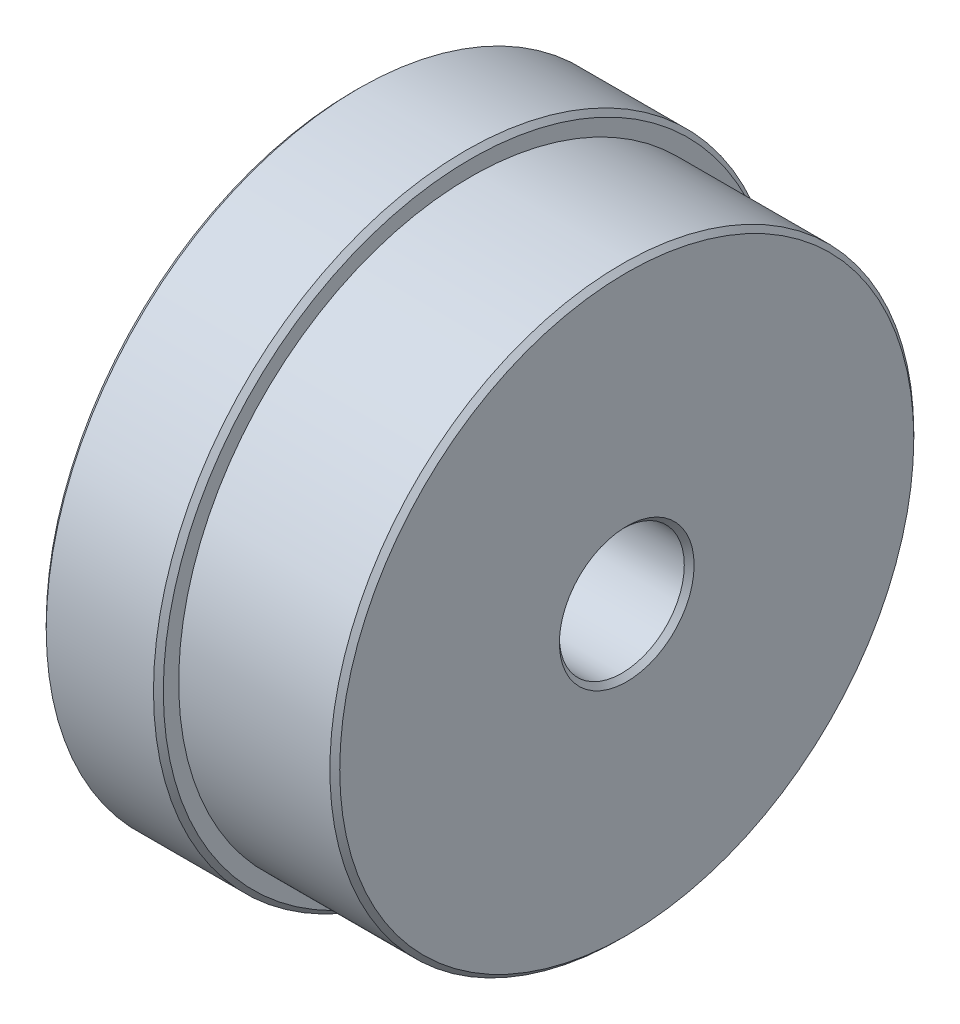
ISO-10303-21;
HEADER;
FILE_DESCRIPTION(('STEP AP214'),'2;1');
FILE_NAME('part.step','',(''),(''),'','','');
FILE_SCHEMA(('AUTOMOTIVE_DESIGN { 1 0 10303 214 1 1 1 1 }'));
ENDSEC;
DATA;
#1=APPLICATION_CONTEXT('core data for automotive mechanical design processes');
#2=APPLICATION_PROTOCOL_DEFINITION('international standard','automotive_design',2000,#1);
#3=PRODUCT_CONTEXT('',#1,'mechanical');
#4=PRODUCT('Part','Part','',(#3));
#5=PRODUCT_RELATED_PRODUCT_CATEGORY('part','',(#4));
#6=PRODUCT_DEFINITION_FORMATION('','',#4);
#7=PRODUCT_DEFINITION_CONTEXT('part definition',#1,'design');
#8=PRODUCT_DEFINITION('design','',#6,#7);
#9=PRODUCT_DEFINITION_SHAPE('','',#8);
#10=(LENGTH_UNIT() NAMED_UNIT(*) SI_UNIT(.MILLI.,.METRE.));
#11=(NAMED_UNIT(*) PLANE_ANGLE_UNIT() SI_UNIT($,.RADIAN.));
#12=(NAMED_UNIT(*) SI_UNIT($,.STERADIAN.) SOLID_ANGLE_UNIT());
#13=UNCERTAINTY_MEASURE_WITH_UNIT(LENGTH_MEASURE(1.E-05),#10,'distance_accuracy_value','');
#14=(GEOMETRIC_REPRESENTATION_CONTEXT(3) GLOBAL_UNCERTAINTY_ASSIGNED_CONTEXT((#13)) GLOBAL_UNIT_ASSIGNED_CONTEXT((#10,
#11,#12)) REPRESENTATION_CONTEXT('',''));
#15=CARTESIAN_POINT('',(0.,0.,0.));
#16=DIRECTION('',(0.,0.,1.));
#17=DIRECTION('',(1.,0.,0.));
#18=AXIS2_PLACEMENT_3D('',#15,#16,#17);
#19=CARTESIAN_POINT('',(12.7,0.,0.));
#20=DIRECTION('',(-1.,0.,0.));
#21=DIRECTION('',(0.,0.,1.));
#22=AXIS2_PLACEMENT_3D('',#19,#20,#21);
#23=CYLINDRICAL_SURFACE('',#22,23.749);
#24=CARTESIAN_POINT('',(12.3,0.,0.));
#25=DIRECTION('',(1.,0.,0.));
#26=DIRECTION('',(0.,0.,-1.));
#27=AXIS2_PLACEMENT_3D('',#24,#25,#26);
#28=CIRCLE('',#27,23.749);
#29=CARTESIAN_POINT('',(12.3,0.,-23.749));
#30=VERTEX_POINT('',#29);
#31=EDGE_CURVE('E45',#30,#30,#28,.F.);
#32=ORIENTED_EDGE('',*,*,#31,.T.);
#33=EDGE_LOOP('',(#32));
#34=FACE_BOUND('',#33,.T.);
#35=CARTESIAN_POINT('',(0.,0.,0.));
#36=DIRECTION('',(1.,0.,0.));
#37=DIRECTION('',(0.,0.,-1.));
#38=AXIS2_PLACEMENT_3D('',#35,#36,#37);
#39=CIRCLE('',#38,23.749);
#40=CARTESIAN_POINT('',(0.,0.,-23.749));
#41=VERTEX_POINT('',#40);
#42=EDGE_CURVE('E76',#41,#41,#39,.T.);
#43=ORIENTED_EDGE('',*,*,#42,.T.);
#44=EDGE_LOOP('',(#43));
#45=FACE_BOUND('',#44,.T.);
#46=ADVANCED_FACE('F37',(#34,#45),#23,.T.);
#47=CARTESIAN_POINT('',(12.7,0.,0.));
#48=DIRECTION('',(1.,0.,0.));
#49=DIRECTION('',(0.,0.,-1.));
#50=AXIS2_PLACEMENT_3D('',#47,#48,#49);
#51=PLANE('',#50);
#52=CARTESIAN_POINT('',(12.7,0.,0.));
#53=DIRECTION('',(1.,0.,0.));
#54=DIRECTION('',(0.,0.,-1.));
#55=AXIS2_PLACEMENT_3D('',#52,#53,#54);
#56=CIRCLE('',#55,23.349);
#57=CARTESIAN_POINT('',(12.7,0.,-23.349));
#58=VERTEX_POINT('',#57);
#59=EDGE_CURVE('E49',#58,#58,#56,.T.);
#60=ORIENTED_EDGE('',*,*,#59,.T.);
#61=EDGE_LOOP('',(#60));
#62=FACE_BOUND('',#61,.T.);
#63=CARTESIAN_POINT('',(12.7,0.,0.));
#64=DIRECTION('',(1.,0.,0.));
#65=DIRECTION('',(0.,0.,-1.));
#66=AXIS2_PLACEMENT_3D('',#63,#64,#65);
#67=CIRCLE('',#66,5.48000000000001);
#68=CARTESIAN_POINT('',(12.7,0.,-5.48000000000001));
#69=VERTEX_POINT('',#68);
#70=EDGE_CURVE('E53',#69,#69,#67,.F.);
#71=ORIENTED_EDGE('',*,*,#70,.T.);
#72=EDGE_LOOP('',(#71));
#73=FACE_BOUND('',#72,.T.);
#74=ADVANCED_FACE('F125',(#62,#73),#51,.T.);
#75=CARTESIAN_POINT('',(-9.525,0.,0.));
#76=DIRECTION('',(1.,0.,0.));
#77=DIRECTION('',(0.,0.,-1.));
#78=AXIS2_PLACEMENT_3D('',#75,#76,#77);
#79=CYLINDRICAL_SURFACE('',#78,25.4);
#80=CARTESIAN_POINT('',(-0.400000000000044,0.,0.));
#81=DIRECTION('',(-1.,0.,0.));
#82=DIRECTION('',(0.,0.,1.));
#83=AXIS2_PLACEMENT_3D('',#80,#81,#82);
#84=CIRCLE('',#83,25.4);
#85=CARTESIAN_POINT('',(-0.400000000000043,0.,-25.4));
#86=VERTEX_POINT('',#85);
#87=EDGE_CURVE('E61',#86,#86,#84,.T.);
#88=CARTESIAN_POINT('',(-9.12500000000004,0.,0.));
#89=DIRECTION('',(-1.,0.,0.));
#90=DIRECTION('',(0.,0.,1.));
#91=AXIS2_PLACEMENT_3D('',#88,#89,#90);
#92=CIRCLE('',#91,25.4);
#93=CARTESIAN_POINT('',(-9.12500000000004,0.,-25.4));
#94=VERTEX_POINT('',#93);
#95=EDGE_CURVE('E64',#94,#94,#92,.F.);
#96=CARTESIAN_POINT('',(-0.400000000000043,0.,-25.4));
#97=CARTESIAN_POINT('',(-0.490885416666709,0.,-25.4));
#98=CARTESIAN_POINT('',(-0.581770833333376,0.,-25.4));
#99=CARTESIAN_POINT('',(-0.763541666666709,0.,-25.4));
#100=CARTESIAN_POINT('',(-0.854427083333375,0.,-25.4));
#101=CARTESIAN_POINT('',(-1.03619791666671,0.,-25.4));
#102=CARTESIAN_POINT('',(-1.12708333333338,0.,-25.4));
#103=CARTESIAN_POINT('',(-1.30885416666671,0.,-25.4));
#104=CARTESIAN_POINT('',(-1.39973958333338,0.,-25.4));
#105=CARTESIAN_POINT('',(-1.58151041666671,0.,-25.4));
#106=CARTESIAN_POINT('',(-1.67239583333337,0.,-25.4));
#107=CARTESIAN_POINT('',(-1.85416666666671,0.,-25.4));
#108=CARTESIAN_POINT('',(-1.94505208333337,0.,-25.4));
#109=CARTESIAN_POINT('',(-2.12682291666671,0.,-25.4));
#110=CARTESIAN_POINT('',(-2.21770833333337,0.,-25.4));
#111=CARTESIAN_POINT('',(-2.39947916666671,0.,-25.4));
#112=CARTESIAN_POINT('',(-2.49036458333337,0.,-25.4));
#113=CARTESIAN_POINT('',(-2.67213541666671,0.,-25.4));
#114=CARTESIAN_POINT('',(-2.76302083333337,0.,-25.4));
#115=CARTESIAN_POINT('',(-2.94479166666671,0.,-25.4));
#116=CARTESIAN_POINT('',(-3.03567708333337,0.,-25.4));
#117=CARTESIAN_POINT('',(-3.21744791666671,0.,-25.4));
#118=CARTESIAN_POINT('',(-3.30833333333337,0.,-25.4));
#119=CARTESIAN_POINT('',(-3.49010416666671,0.,-25.4));
#120=CARTESIAN_POINT('',(-3.58098958333337,0.,-25.4));
#121=CARTESIAN_POINT('',(-3.76276041666671,0.,-25.4));
#122=CARTESIAN_POINT('',(-3.85364583333337,0.,-25.4));
#123=CARTESIAN_POINT('',(-4.03541666666671,0.,-25.4));
#124=CARTESIAN_POINT('',(-4.12630208333337,0.,-25.4));
#125=CARTESIAN_POINT('',(-4.30807291666671,0.,-25.4));
#126=CARTESIAN_POINT('',(-4.39895833333337,0.,-25.4));
#127=CARTESIAN_POINT('',(-4.58072916666671,0.,-25.4));
#128=CARTESIAN_POINT('',(-4.67161458333337,0.,-25.4));
#129=CARTESIAN_POINT('',(-4.85338541666671,0.,-25.4));
#130=CARTESIAN_POINT('',(-4.94427083333337,0.,-25.4));
#131=CARTESIAN_POINT('',(-5.12604166666671,0.,-25.4));
#132=CARTESIAN_POINT('',(-5.21692708333337,0.,-25.4));
#133=CARTESIAN_POINT('',(-5.39869791666671,0.,-25.4));
#134=CARTESIAN_POINT('',(-5.48958333333337,0.,-25.4));
#135=CARTESIAN_POINT('',(-5.67135416666671,0.,-25.4));
#136=CARTESIAN_POINT('',(-5.76223958333337,0.,-25.4));
#137=CARTESIAN_POINT('',(-5.94401041666671,0.,-25.4));
#138=CARTESIAN_POINT('',(-6.03489583333337,0.,-25.4));
#139=CARTESIAN_POINT('',(-6.2166666666667,0.,-25.4));
#140=CARTESIAN_POINT('',(-6.30755208333337,0.,-25.4));
#141=CARTESIAN_POINT('',(-6.48932291666671,0.,-25.4));
#142=CARTESIAN_POINT('',(-6.58020833333337,0.,-25.4));
#143=CARTESIAN_POINT('',(-6.76197916666671,0.,-25.4));
#144=CARTESIAN_POINT('',(-6.85286458333337,0.,-25.4));
#145=CARTESIAN_POINT('',(-7.0346354166667,0.,-25.4));
#146=CARTESIAN_POINT('',(-7.12552083333337,0.,-25.4));
#147=CARTESIAN_POINT('',(-7.30729166666671,0.,-25.4));
#148=CARTESIAN_POINT('',(-7.39817708333337,0.,-25.4));
#149=CARTESIAN_POINT('',(-7.5799479166667,0.,-25.4));
#150=CARTESIAN_POINT('',(-7.67083333333337,0.,-25.4));
#151=CARTESIAN_POINT('',(-7.85260416666671,0.,-25.4));
#152=CARTESIAN_POINT('',(-7.94348958333337,0.,-25.4));
#153=CARTESIAN_POINT('',(-8.12526041666671,0.,-25.4));
#154=CARTESIAN_POINT('',(-8.21614583333337,0.,-25.4));
#155=CARTESIAN_POINT('',(-8.3979166666667,0.,-25.4));
#156=CARTESIAN_POINT('',(-8.48880208333337,0.,-25.4));
#157=CARTESIAN_POINT('',(-8.67057291666671,0.,-25.4));
#158=CARTESIAN_POINT('',(-8.76145833333337,0.,-25.4));
#159=CARTESIAN_POINT('',(-8.94322916666671,0.,-25.4));
#160=CARTESIAN_POINT('',(-9.03411458333337,0.,-25.4));
#161=CARTESIAN_POINT('',(-9.12500000000004,0.,-25.4));
#162=B_SPLINE_CURVE_WITH_KNOTS('',3,(#96,#97,#98,#99,#100,#101,#102,#103,#104,#105,#106,#107,
#108,#109,#110,#111,#112,#113,#114,#115,#116,#117,#118,#119,#120,#121,#122,#123,#124,#125,#126,
#127,#128,#129,#130,#131,#132,#133,#134,#135,#136,#137,#138,#139,#140,#141,#142,#143,#144,#145,
#146,#147,#148,#149,#150,#151,#152,#153,#154,#155,#156,#157,#158,#159,#160,#161),.UNSPECIFIED.,
.F.,.F.,(4,2,2,2,2,2,2,2,2,2,2,2,2,2,2,2,2,2,2,2,2,2,2,2,2,2,2,2,2,2,2,2,4),(0.,
0.272656249999999,0.545312499999999,0.81796875,1.090625,1.36328125,1.6359375,1.90859375,2.18125,
2.45390625,2.7265625,2.99921875,3.271875,3.54453125,3.8171875,4.08984375,4.3625,4.63515625,
4.9078125,5.18046875,5.453125,5.72578125,5.9984375,6.27109375,6.54375,6.81640625,7.0890625,
7.36171875,7.634375,7.90703124999999,8.1796875,8.45234375,8.72499999999999),.UNSPECIFIED.);
#163=EDGE_CURVE('BSEAM130',#86,#94,#162,.T.);
#164=ORIENTED_EDGE('',*,*,#87,.T.);
#165=ORIENTED_EDGE('',*,*,#95,.T.);
#166=ORIENTED_EDGE('',*,*,#163,.T.);
#167=ORIENTED_EDGE('',*,*,#163,.F.);
#168=EDGE_LOOP('',(#164,#166,#165,#167));
#169=FACE_BOUND('',#168,.T.);
#170=ADVANCED_FACE('F130',(#169),#79,.T.);
#171=CARTESIAN_POINT('',(-9.525,0.,0.));
#172=DIRECTION('',(-1.,0.,0.));
#173=DIRECTION('',(0.,0.,1.));
#174=AXIS2_PLACEMENT_3D('',#171,#172,#173);
#175=PLANE('',#174);
#176=CARTESIAN_POINT('',(-9.525,0.,0.));
#177=DIRECTION('',(-1.,0.,0.));
#178=DIRECTION('',(0.,0.,1.));
#179=AXIS2_PLACEMENT_3D('',#176,#177,#178);
#180=CIRCLE('',#179,11.5125);
#181=CARTESIAN_POINT('',(-9.525,0.,11.5125));
#182=VERTEX_POINT('',#181);
#183=EDGE_CURVE('E67',#182,#182,#180,.F.);
#184=ORIENTED_EDGE('',*,*,#183,.T.);
#185=EDGE_LOOP('',(#184));
#186=FACE_BOUND('',#185,.T.);
#187=CARTESIAN_POINT('',(-9.525,0.,0.));
#188=DIRECTION('',(-1.,0.,0.));
#189=DIRECTION('',(0.,0.,1.));
#190=AXIS2_PLACEMENT_3D('',#187,#188,#189);
#191=CIRCLE('',#190,25.);
#192=CARTESIAN_POINT('',(-9.525,0.,25.));
#193=VERTEX_POINT('',#192);
#194=EDGE_CURVE('E70',#193,#193,#191,.T.);
#195=ORIENTED_EDGE('',*,*,#194,.T.);
#196=EDGE_LOOP('',(#195));
#197=FACE_BOUND('',#196,.T.);
#198=ADVANCED_FACE('F120',(#186,#197),#175,.T.);
#199=CARTESIAN_POINT('',(0.,0.,0.));
#200=DIRECTION('',(-1.,0.,0.));
#201=DIRECTION('',(0.,0.,1.));
#202=AXIS2_PLACEMENT_3D('',#199,#200,#201);
#203=PLANE('',#202);
#204=CARTESIAN_POINT('',(0.,0.,0.));
#205=DIRECTION('',(-1.,0.,0.));
#206=DIRECTION('',(0.,0.,1.));
#207=AXIS2_PLACEMENT_3D('',#204,#205,#206);
#208=CIRCLE('',#207,25.);
#209=CARTESIAN_POINT('',(0.,0.,25.));
#210=VERTEX_POINT('',#209);
#211=EDGE_CURVE('E58',#210,#210,#208,.F.);
#212=ORIENTED_EDGE('',*,*,#211,.T.);
#213=EDGE_LOOP('',(#212));
#214=FACE_BOUND('',#213,.T.);
#215=ORIENTED_EDGE('',*,*,#42,.F.);
#216=EDGE_LOOP('',(#215));
#217=FACE_BOUND('',#216,.T.);
#218=ADVANCED_FACE('F114',(#214,#217),#203,.F.);
#219=CARTESIAN_POINT('',(-2.413,0.,0.));
#220=DIRECTION('',(-1.,0.,0.));
#221=DIRECTION('',(0.,0.,1.));
#222=AXIS2_PLACEMENT_3D('',#219,#220,#221);
#223=CYLINDRICAL_SURFACE('',#222,11.1125);
#224=CARTESIAN_POINT('',(-9.12500000000001,0.,0.));
#225=DIRECTION('',(-1.,0.,0.));
#226=DIRECTION('',(0.,0.,1.));
#227=AXIS2_PLACEMENT_3D('',#224,#225,#226);
#228=CIRCLE('',#227,11.1125);
#229=CARTESIAN_POINT('',(-9.12500000000001,0.,11.1125));
#230=VERTEX_POINT('',#229);
#231=EDGE_CURVE('E73',#230,#230,#228,.T.);
#232=ORIENTED_EDGE('',*,*,#231,.T.);
#233=EDGE_LOOP('',(#232));
#234=FACE_BOUND('',#233,.T.);
#235=CARTESIAN_POINT('',(-2.413,0.,0.));
#236=DIRECTION('',(-1.,0.,0.));
#237=DIRECTION('',(0.,0.,1.));
#238=AXIS2_PLACEMENT_3D('',#235,#236,#237);
#239=CIRCLE('',#238,11.1125);
#240=CARTESIAN_POINT('',(-2.413,0.,11.1125));
#241=VERTEX_POINT('',#240);
#242=EDGE_CURVE('E79',#241,#241,#239,.T.);
#243=ORIENTED_EDGE('',*,*,#242,.F.);
#244=EDGE_LOOP('',(#243));
#245=FACE_BOUND('',#244,.T.);
#246=ADVANCED_FACE('F109',(#234,#245),#223,.F.);
#247=CARTESIAN_POINT('',(-2.413,0.,0.));
#248=DIRECTION('',(-1.,0.,0.));
#249=DIRECTION('',(0.,0.,1.));
#250=AXIS2_PLACEMENT_3D('',#247,#248,#249);
#251=PLANE('',#250);
#252=CARTESIAN_POINT('',(-2.413,0.,0.));
#253=DIRECTION('',(-1.,0.,0.));
#254=DIRECTION('',(0.,0.,1.));
#255=AXIS2_PLACEMENT_3D('',#252,#253,#254);
#256=CIRCLE('',#255,7.27458794);
#257=CARTESIAN_POINT('',(-2.413,0.,7.27458794));
#258=VERTEX_POINT('',#257);
#259=EDGE_CURVE('E83',#258,#258,#256,.T.);
#260=ORIENTED_EDGE('',*,*,#259,.F.);
#261=EDGE_LOOP('',(#260));
#262=FACE_BOUND('',#261,.T.);
#263=ORIENTED_EDGE('',*,*,#242,.T.);
#264=EDGE_LOOP('',(#263));
#265=FACE_BOUND('',#264,.T.);
#266=ADVANCED_FACE('F103',(#262,#265),#251,.T.);
#267=CARTESIAN_POINT('',(-2.213,0.,0.));
#268=DIRECTION('',(-1.,0.,0.));
#269=DIRECTION('',(0.,0.,1.));
#270=AXIS2_PLACEMENT_3D('',#267,#268,#269);
#271=CYLINDRICAL_SURFACE('',#270,7.27458794);
#272=CARTESIAN_POINT('',(-2.213,0.,0.));
#273=DIRECTION('',(-1.,0.,0.));
#274=DIRECTION('',(0.,0.,1.));
#275=AXIS2_PLACEMENT_3D('',#272,#273,#274);
#276=CIRCLE('',#275,7.27458794);
#277=CARTESIAN_POINT('',(-2.213,0.,7.27458794));
#278=VERTEX_POINT('',#277);
#279=EDGE_CURVE('E82',#278,#278,#276,.T.);
#280=ORIENTED_EDGE('',*,*,#279,.F.);
#281=EDGE_LOOP('',(#280));
#282=FACE_BOUND('',#281,.T.);
#283=ORIENTED_EDGE('',*,*,#259,.T.);
#284=EDGE_LOOP('',(#283));
#285=FACE_BOUND('',#284,.T.);
#286=ADVANCED_FACE('F97',(#282,#285),#271,.F.);
#287=CARTESIAN_POINT('',(-2.213,0.,0.));
#288=DIRECTION('',(-1.,0.,0.));
#289=DIRECTION('',(0.,0.,1.));
#290=AXIS2_PLACEMENT_3D('',#287,#288,#289);
#291=PLANE('',#290);
#292=CARTESIAN_POINT('',(-2.213,0.,0.));
#293=DIRECTION('',(-1.,0.,0.));
#294=DIRECTION('',(0.,0.,1.));
#295=AXIS2_PLACEMENT_3D('',#292,#293,#294);
#296=CIRCLE('',#295,5.08);
#297=CARTESIAN_POINT('',(-2.213,0.,5.08));
#298=VERTEX_POINT('',#297);
#299=EDGE_CURVE('E86',#298,#298,#296,.T.);
#300=ORIENTED_EDGE('',*,*,#299,.F.);
#301=EDGE_LOOP('',(#300));
#302=FACE_BOUND('',#301,.T.);
#303=ORIENTED_EDGE('',*,*,#279,.T.);
#304=EDGE_LOOP('',(#303));
#305=FACE_BOUND('',#304,.T.);
#306=ADVANCED_FACE('F94',(#302,#305),#291,.T.);
#307=CARTESIAN_POINT('',(12.7,0.,0.));
#308=DIRECTION('',(-1.,0.,0.));
#309=DIRECTION('',(0.,0.,1.));
#310=AXIS2_PLACEMENT_3D('',#307,#308,#309);
#311=CYLINDRICAL_SURFACE('',#310,5.08);
#312=CARTESIAN_POINT('',(12.3,0.,0.));
#313=DIRECTION('',(1.,0.,0.));
#314=DIRECTION('',(0.,0.,-1.));
#315=AXIS2_PLACEMENT_3D('',#312,#313,#314);
#316=CIRCLE('',#315,5.08);
#317=CARTESIAN_POINT('',(12.3,0.,-5.08));
#318=VERTEX_POINT('',#317);
#319=EDGE_CURVE('E10',#318,#318,#316,.T.);
#320=ORIENTED_EDGE('',*,*,#319,.T.);
#321=EDGE_LOOP('',(#320));
#322=FACE_BOUND('',#321,.T.);
#323=ORIENTED_EDGE('',*,*,#299,.T.);
#324=EDGE_LOOP('',(#323));
#325=FACE_BOUND('',#324,.T.);
#326=ADVANCED_FACE('F92',(#322,#325),#311,.F.);
#327=CARTESIAN_POINT('',(-9.12500000000001,0.,0.));
#328=DIRECTION('',(-1.,0.,0.));
#329=DIRECTION('',(0.,0.,1.));
#330=AXIS2_PLACEMENT_3D('',#327,#328,#329);
#331=CONICAL_SURFACE('',#330,11.1125,0.785398163397453);
#332=ORIENTED_EDGE('',*,*,#183,.F.);
#333=EDGE_LOOP('',(#332));
#334=FACE_BOUND('',#333,.T.);
#335=ORIENTED_EDGE('',*,*,#231,.F.);
#336=EDGE_LOOP('',(#335));
#337=FACE_BOUND('',#336,.T.);
#338=ADVANCED_FACE('F137',(#334,#337),#331,.F.);
#339=CARTESIAN_POINT('',(-0.400000000000043,0.,0.));
#340=DIRECTION('',(-1.,0.,0.));
#341=DIRECTION('',(0.,0.,1.));
#342=AXIS2_PLACEMENT_3D('',#339,#340,#341);
#343=CONICAL_SURFACE('',#342,25.4,0.785398163397444);
#344=ORIENTED_EDGE('',*,*,#211,.F.);
#345=EDGE_LOOP('',(#344));
#346=FACE_BOUND('',#345,.T.);
#347=ORIENTED_EDGE('',*,*,#87,.F.);
#348=EDGE_LOOP('',(#347));
#349=FACE_BOUND('',#348,.T.);
#350=ADVANCED_FACE('F143',(#346,#349),#343,.T.);
#351=CARTESIAN_POINT('',(-9.525,0.,0.));
#352=DIRECTION('',(1.,0.,0.));
#353=DIRECTION('',(0.,0.,-1.));
#354=AXIS2_PLACEMENT_3D('',#351,#352,#353);
#355=CONICAL_SURFACE('',#354,25.,0.785398163397461);
#356=ORIENTED_EDGE('',*,*,#95,.F.);
#357=EDGE_LOOP('',(#356));
#358=FACE_BOUND('',#357,.T.);
#359=ORIENTED_EDGE('',*,*,#194,.F.);
#360=EDGE_LOOP('',(#359));
#361=FACE_BOUND('',#360,.T.);
#362=ADVANCED_FACE('F150',(#358,#361),#355,.T.);
#363=CARTESIAN_POINT('',(12.7,0.,0.));
#364=DIRECTION('',(-1.,0.,0.));
#365=DIRECTION('',(0.,0.,1.));
#366=AXIS2_PLACEMENT_3D('',#363,#364,#365);
#367=CONICAL_SURFACE('',#366,23.349,0.785398163397431);
#368=ORIENTED_EDGE('',*,*,#31,.F.);
#369=EDGE_LOOP('',(#368));
#370=FACE_BOUND('',#369,.T.);
#371=ORIENTED_EDGE('',*,*,#59,.F.);
#372=EDGE_LOOP('',(#371));
#373=FACE_BOUND('',#372,.T.);
#374=ADVANCED_FACE('F156',(#370,#373),#367,.T.);
#375=CARTESIAN_POINT('',(12.7,0.,0.));
#376=DIRECTION('',(1.,0.,0.));
#377=DIRECTION('',(0.,0.,-1.));
#378=AXIS2_PLACEMENT_3D('',#375,#376,#377);
#379=CONICAL_SURFACE('',#378,5.48000000000001,0.785398163397447);
#380=ORIENTED_EDGE('',*,*,#319,.F.);
#381=EDGE_LOOP('',(#380));
#382=FACE_BOUND('',#381,.T.);
#383=ORIENTED_EDGE('',*,*,#70,.F.);
#384=EDGE_LOOP('',(#383));
#385=FACE_BOUND('',#384,.T.);
#386=ADVANCED_FACE('F40',(#382,#385),#379,.F.);
#387=CLOSED_SHELL('',(#46,#74,#170,#198,#218,#246,#266,#286,#306,#326,#338,#350,#362,#374,#386));
#388=MANIFOLD_SOLID_BREP('B2',#387);
#389=ADVANCED_BREP_SHAPE_REPRESENTATION('',(#18,#388),#14);
#390=SHAPE_DEFINITION_REPRESENTATION(#9,#389);
ENDSEC;
END-ISO-10303-21;
